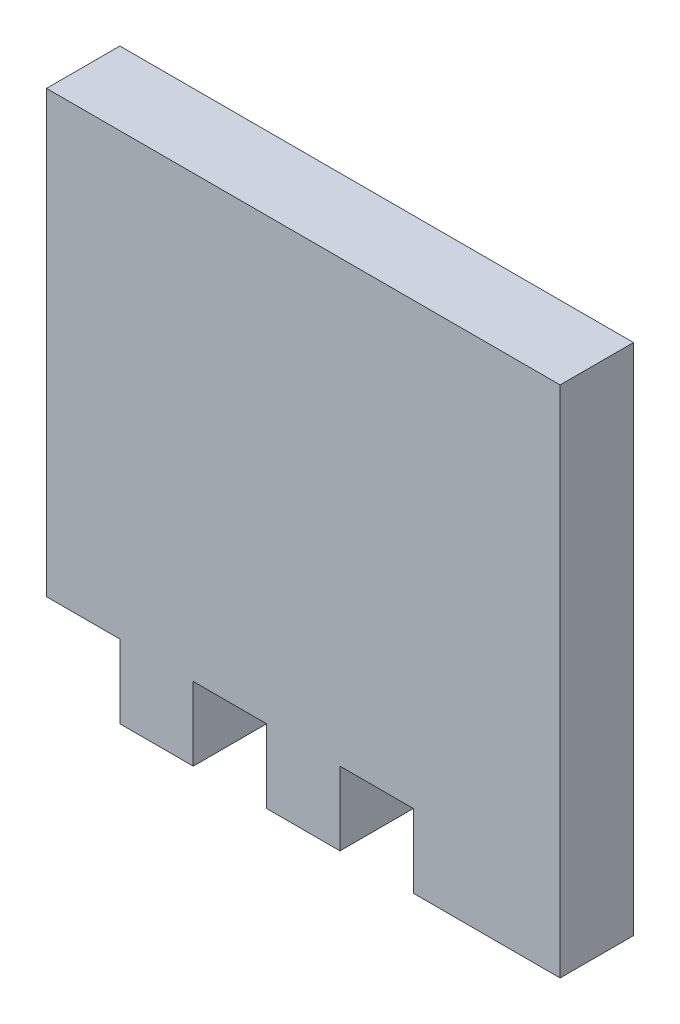
ISO-10303-21;
HEADER;
FILE_DESCRIPTION(('STEP AP214'),'2;1');
FILE_NAME('part.step','',(''),(''),'','','');
FILE_SCHEMA(('AUTOMOTIVE_DESIGN { 1 0 10303 214 1 1 1 1 }'));
ENDSEC;
DATA;
#1=APPLICATION_CONTEXT('core data for automotive mechanical design processes');
#2=APPLICATION_PROTOCOL_DEFINITION('international standard','automotive_design',2000,#1);
#3=PRODUCT_CONTEXT('',#1,'mechanical');
#4=PRODUCT('Part','Part','',(#3));
#5=PRODUCT_RELATED_PRODUCT_CATEGORY('part','',(#4));
#6=PRODUCT_DEFINITION_FORMATION('','',#4);
#7=PRODUCT_DEFINITION_CONTEXT('part definition',#1,'design');
#8=PRODUCT_DEFINITION('design','',#6,#7);
#9=PRODUCT_DEFINITION_SHAPE('','',#8);
#10=(LENGTH_UNIT() NAMED_UNIT(*) SI_UNIT(.MILLI.,.METRE.));
#11=(NAMED_UNIT(*) PLANE_ANGLE_UNIT() SI_UNIT($,.RADIAN.));
#12=(NAMED_UNIT(*) SI_UNIT($,.STERADIAN.) SOLID_ANGLE_UNIT());
#13=UNCERTAINTY_MEASURE_WITH_UNIT(LENGTH_MEASURE(1.E-05),#10,'distance_accuracy_value','');
#14=(GEOMETRIC_REPRESENTATION_CONTEXT(3) GLOBAL_UNCERTAINTY_ASSIGNED_CONTEXT((#13)) GLOBAL_UNIT_ASSIGNED_CONTEXT((#10,
#11,#12)) REPRESENTATION_CONTEXT('',''));
#15=CARTESIAN_POINT('',(0.,0.,0.));
#16=DIRECTION('',(0.,0.,1.));
#17=DIRECTION('',(1.,0.,0.));
#18=AXIS2_PLACEMENT_3D('',#15,#16,#17);
#19=CARTESIAN_POINT('',(-68.9999160612194,0.,5.));
#20=DIRECTION('',(1.,0.,0.));
#21=DIRECTION('',(0.,0.,-1.));
#22=AXIS2_PLACEMENT_3D('',#19,#20,#21);
#23=PLANE('',#22);
#24=DIRECTION('',(0.,-1.,0.));
#25=VECTOR('',#24,1.);
#26=CARTESIAN_POINT('',(-68.9999160612194,0.,0.));
#27=LINE('',#26,#25);
#28=CARTESIAN_POINT('',(-68.9999160612194,30.,0.));
#29=VERTEX_POINT('',#28);
#30=CARTESIAN_POINT('',(-68.9999160612194,0.,0.));
#31=VERTEX_POINT('',#30);
#32=EDGE_CURVE('E164',#29,#31,#27,.T.);
#33=ORIENTED_EDGE('',*,*,#32,.T.);
#34=DIRECTION('',(0.,0.,-1.));
#35=VECTOR('',#34,1.);
#36=CARTESIAN_POINT('',(-68.9999160612194,0.,5.));
#37=LINE('',#36,#35);
#38=CARTESIAN_POINT('',(-68.9999160612194,0.,5.));
#39=VERTEX_POINT('',#38);
#40=EDGE_CURVE('E11',#39,#31,#37,.T.);
#41=ORIENTED_EDGE('',*,*,#40,.F.);
#42=DIRECTION('',(0.,-1.,0.));
#43=VECTOR('',#42,1.);
#44=CARTESIAN_POINT('',(-68.9999160612194,0.,5.));
#45=LINE('',#44,#43);
#46=CARTESIAN_POINT('',(-68.9999160612194,30.,5.));
#47=VERTEX_POINT('',#46);
#48=EDGE_CURVE('E190',#47,#39,#45,.T.);
#49=ORIENTED_EDGE('',*,*,#48,.F.);
#50=DIRECTION('',(0.,0.,-1.));
#51=VECTOR('',#50,1.);
#52=CARTESIAN_POINT('',(-68.9999160612194,30.,5.));
#53=LINE('',#52,#51);
#54=EDGE_CURVE('E160',#47,#29,#53,.T.);
#55=ORIENTED_EDGE('',*,*,#54,.T.);
#56=EDGE_LOOP('',(#33,#41,#49,#55));
#57=FACE_BOUND('',#56,.T.);
#58=ADVANCED_FACE('F32',(#57),#23,.F.);
#59=CARTESIAN_POINT('',(-68.9999160612194,0.,5.));
#60=DIRECTION('',(0.,1.,0.));
#61=DIRECTION('',(0.,0.,1.));
#62=AXIS2_PLACEMENT_3D('',#59,#60,#61);
#63=PLANE('',#62);
#64=DIRECTION('',(1.,0.,0.));
#65=VECTOR('',#64,1.);
#66=CARTESIAN_POINT('',(-68.9999160612194,0.,0.));
#67=LINE('',#66,#65);
#68=CARTESIAN_POINT('',(-63.9999160612194,0.,0.));
#69=VERTEX_POINT('',#68);
#70=EDGE_CURVE('E167',#31,#69,#67,.T.);
#71=ORIENTED_EDGE('',*,*,#70,.T.);
#72=DIRECTION('',(0.,0.,-1.));
#73=VECTOR('',#72,1.);
#74=CARTESIAN_POINT('',(-63.9999160612194,0.,5.));
#75=LINE('',#74,#73);
#76=CARTESIAN_POINT('',(-63.9999160612194,0.,5.));
#77=VERTEX_POINT('',#76);
#78=EDGE_CURVE('E40',#77,#69,#75,.T.);
#79=ORIENTED_EDGE('',*,*,#78,.F.);
#80=DIRECTION('',(1.,0.,0.));
#81=VECTOR('',#80,1.);
#82=CARTESIAN_POINT('',(-68.9999160612194,0.,5.));
#83=LINE('',#82,#81);
#84=EDGE_CURVE('E109',#39,#77,#83,.T.);
#85=ORIENTED_EDGE('',*,*,#84,.F.);
#86=ORIENTED_EDGE('',*,*,#40,.T.);
#87=EDGE_LOOP('',(#71,#79,#85,#86));
#88=FACE_BOUND('',#87,.T.);
#89=ADVANCED_FACE('F278',(#88),#63,.F.);
#90=CARTESIAN_POINT('',(-63.9999160612194,0.,5.));
#91=DIRECTION('',(1.,0.,0.));
#92=DIRECTION('',(0.,0.,-1.));
#93=AXIS2_PLACEMENT_3D('',#90,#91,#92);
#94=PLANE('',#93);
#95=DIRECTION('',(0.,-1.,0.));
#96=VECTOR('',#95,1.);
#97=CARTESIAN_POINT('',(-63.9999160612194,0.,0.));
#98=LINE('',#97,#96);
#99=CARTESIAN_POINT('',(-63.9999160612194,-5.,0.));
#100=VERTEX_POINT('',#99);
#101=EDGE_CURVE('E169',#69,#100,#98,.T.);
#102=ORIENTED_EDGE('',*,*,#101,.T.);
#103=DIRECTION('',(0.,0.,-1.));
#104=VECTOR('',#103,1.);
#105=CARTESIAN_POINT('',(-63.9999160612194,-5.,5.));
#106=LINE('',#105,#104);
#107=CARTESIAN_POINT('',(-63.9999160612194,-5.,5.));
#108=VERTEX_POINT('',#107);
#109=EDGE_CURVE('E215',#108,#100,#106,.T.);
#110=ORIENTED_EDGE('',*,*,#109,.F.);
#111=DIRECTION('',(0.,-1.,0.));
#112=VECTOR('',#111,1.);
#113=CARTESIAN_POINT('',(-63.9999160612194,0.,5.));
#114=LINE('',#113,#112);
#115=EDGE_CURVE('E223',#77,#108,#114,.T.);
#116=ORIENTED_EDGE('',*,*,#115,.F.);
#117=ORIENTED_EDGE('',*,*,#78,.T.);
#118=EDGE_LOOP('',(#102,#110,#116,#117));
#119=FACE_BOUND('',#118,.T.);
#120=ADVANCED_FACE('F221',(#119),#94,.F.);
#121=CARTESIAN_POINT('',(-63.9999160612194,-5.,5.));
#122=DIRECTION('',(0.,1.,0.));
#123=DIRECTION('',(0.,0.,1.));
#124=AXIS2_PLACEMENT_3D('',#121,#122,#123);
#125=PLANE('',#124);
#126=DIRECTION('',(1.,0.,0.));
#127=VECTOR('',#126,1.);
#128=CARTESIAN_POINT('',(-63.9999160612194,-5.,0.));
#129=LINE('',#128,#127);
#130=CARTESIAN_POINT('',(-58.9999160612194,-5.,0.));
#131=VERTEX_POINT('',#130);
#132=EDGE_CURVE('E171',#100,#131,#129,.T.);
#133=ORIENTED_EDGE('',*,*,#132,.T.);
#134=DIRECTION('',(0.,0.,-1.));
#135=VECTOR('',#134,1.);
#136=CARTESIAN_POINT('',(-58.9999160612194,-5.,5.));
#137=LINE('',#136,#135);
#138=CARTESIAN_POINT('',(-58.9999160612194,-5.,5.));
#139=VERTEX_POINT('',#138);
#140=EDGE_CURVE('E212',#139,#131,#137,.T.);
#141=ORIENTED_EDGE('',*,*,#140,.F.);
#142=DIRECTION('',(1.,0.,0.));
#143=VECTOR('',#142,1.);
#144=CARTESIAN_POINT('',(-63.9999160612194,-5.,5.));
#145=LINE('',#144,#143);
#146=EDGE_CURVE('E241',#108,#139,#145,.T.);
#147=ORIENTED_EDGE('',*,*,#146,.F.);
#148=ORIENTED_EDGE('',*,*,#109,.T.);
#149=EDGE_LOOP('',(#133,#141,#147,#148));
#150=FACE_BOUND('',#149,.T.);
#151=ADVANCED_FACE('F232',(#150),#125,.F.);
#152=CARTESIAN_POINT('',(-58.9999160612194,-5.,5.));
#153=DIRECTION('',(-1.,0.,0.));
#154=DIRECTION('',(0.,0.,1.));
#155=AXIS2_PLACEMENT_3D('',#152,#153,#154);
#156=PLANE('',#155);
#157=DIRECTION('',(0.,1.,0.));
#158=VECTOR('',#157,1.);
#159=CARTESIAN_POINT('',(-58.9999160612194,-5.,0.));
#160=LINE('',#159,#158);
#161=CARTESIAN_POINT('',(-58.9999160612194,0.,0.));
#162=VERTEX_POINT('',#161);
#163=EDGE_CURVE('E173',#131,#162,#160,.T.);
#164=ORIENTED_EDGE('',*,*,#163,.T.);
#165=DIRECTION('',(0.,0.,-1.));
#166=VECTOR('',#165,1.);
#167=CARTESIAN_POINT('',(-58.9999160612194,0.,5.));
#168=LINE('',#167,#166);
#169=CARTESIAN_POINT('',(-58.9999160612194,0.,5.));
#170=VERTEX_POINT('',#169);
#171=EDGE_CURVE('E209',#170,#162,#168,.T.);
#172=ORIENTED_EDGE('',*,*,#171,.F.);
#173=DIRECTION('',(0.,1.,0.));
#174=VECTOR('',#173,1.);
#175=CARTESIAN_POINT('',(-58.9999160612194,-5.,5.));
#176=LINE('',#175,#174);
#177=EDGE_CURVE('E238',#139,#170,#176,.T.);
#178=ORIENTED_EDGE('',*,*,#177,.F.);
#179=ORIENTED_EDGE('',*,*,#140,.T.);
#180=EDGE_LOOP('',(#164,#172,#178,#179));
#181=FACE_BOUND('',#180,.T.);
#182=ADVANCED_FACE('F236',(#181),#156,.F.);
#183=CARTESIAN_POINT('',(-58.9999160612194,0.,5.));
#184=DIRECTION('',(0.,1.,0.));
#185=DIRECTION('',(0.,0.,1.));
#186=AXIS2_PLACEMENT_3D('',#183,#184,#185);
#187=PLANE('',#186);
#188=DIRECTION('',(1.,0.,0.));
#189=VECTOR('',#188,1.);
#190=CARTESIAN_POINT('',(-58.9999160612194,0.,0.));
#191=LINE('',#190,#189);
#192=CARTESIAN_POINT('',(-53.9999160612194,0.,0.));
#193=VERTEX_POINT('',#192);
#194=EDGE_CURVE('E175',#162,#193,#191,.T.);
#195=ORIENTED_EDGE('',*,*,#194,.T.);
#196=DIRECTION('',(0.,0.,-1.));
#197=VECTOR('',#196,1.);
#198=CARTESIAN_POINT('',(-53.9999160612194,0.,5.));
#199=LINE('',#198,#197);
#200=CARTESIAN_POINT('',(-53.9999160612194,0.,5.));
#201=VERTEX_POINT('',#200);
#202=EDGE_CURVE('E206',#201,#193,#199,.T.);
#203=ORIENTED_EDGE('',*,*,#202,.F.);
#204=DIRECTION('',(1.,0.,0.));
#205=VECTOR('',#204,1.);
#206=CARTESIAN_POINT('',(-58.9999160612194,0.,5.));
#207=LINE('',#206,#205);
#208=EDGE_CURVE('E240',#170,#201,#207,.T.);
#209=ORIENTED_EDGE('',*,*,#208,.F.);
#210=ORIENTED_EDGE('',*,*,#171,.T.);
#211=EDGE_LOOP('',(#195,#203,#209,#210));
#212=FACE_BOUND('',#211,.T.);
#213=ADVANCED_FACE('F291',(#212),#187,.F.);
#214=CARTESIAN_POINT('',(-53.9999160612194,0.,5.));
#215=DIRECTION('',(1.,0.,0.));
#216=DIRECTION('',(0.,0.,-1.));
#217=AXIS2_PLACEMENT_3D('',#214,#215,#216);
#218=PLANE('',#217);
#219=DIRECTION('',(0.,-1.,0.));
#220=VECTOR('',#219,1.);
#221=CARTESIAN_POINT('',(-53.9999160612194,0.,0.));
#222=LINE('',#221,#220);
#223=CARTESIAN_POINT('',(-53.9999160612194,-5.,0.));
#224=VERTEX_POINT('',#223);
#225=EDGE_CURVE('E177',#193,#224,#222,.T.);
#226=ORIENTED_EDGE('',*,*,#225,.T.);
#227=DIRECTION('',(0.,0.,-1.));
#228=VECTOR('',#227,1.);
#229=CARTESIAN_POINT('',(-53.9999160612194,-5.,5.));
#230=LINE('',#229,#228);
#231=CARTESIAN_POINT('',(-53.9999160612194,-5.,5.));
#232=VERTEX_POINT('',#231);
#233=EDGE_CURVE('E203',#232,#224,#230,.T.);
#234=ORIENTED_EDGE('',*,*,#233,.F.);
#235=DIRECTION('',(0.,-1.,0.));
#236=VECTOR('',#235,1.);
#237=CARTESIAN_POINT('',(-53.9999160612194,0.,5.));
#238=LINE('',#237,#236);
#239=EDGE_CURVE('E243',#201,#232,#238,.T.);
#240=ORIENTED_EDGE('',*,*,#239,.F.);
#241=ORIENTED_EDGE('',*,*,#202,.T.);
#242=EDGE_LOOP('',(#226,#234,#240,#241));
#243=FACE_BOUND('',#242,.T.);
#244=ADVANCED_FACE('F294',(#243),#218,.F.);
#245=CARTESIAN_POINT('',(-53.9999160612194,-5.,5.));
#246=DIRECTION('',(0.,1.,0.));
#247=DIRECTION('',(0.,0.,1.));
#248=AXIS2_PLACEMENT_3D('',#245,#246,#247);
#249=PLANE('',#248);
#250=DIRECTION('',(1.,0.,0.));
#251=VECTOR('',#250,1.);
#252=CARTESIAN_POINT('',(-53.9999160612194,-5.,0.));
#253=LINE('',#252,#251);
#254=CARTESIAN_POINT('',(-48.9999160612194,-5.,0.));
#255=VERTEX_POINT('',#254);
#256=EDGE_CURVE('E179',#224,#255,#253,.T.);
#257=ORIENTED_EDGE('',*,*,#256,.T.);
#258=DIRECTION('',(0.,0.,-1.));
#259=VECTOR('',#258,1.);
#260=CARTESIAN_POINT('',(-48.9999160612194,-5.,5.));
#261=LINE('',#260,#259);
#262=CARTESIAN_POINT('',(-48.9999160612194,-5.,5.));
#263=VERTEX_POINT('',#262);
#264=EDGE_CURVE('E200',#263,#255,#261,.T.);
#265=ORIENTED_EDGE('',*,*,#264,.F.);
#266=DIRECTION('',(1.,0.,0.));
#267=VECTOR('',#266,1.);
#268=CARTESIAN_POINT('',(-53.9999160612194,-5.,5.));
#269=LINE('',#268,#267);
#270=EDGE_CURVE('E249',#232,#263,#269,.T.);
#271=ORIENTED_EDGE('',*,*,#270,.F.);
#272=ORIENTED_EDGE('',*,*,#233,.T.);
#273=EDGE_LOOP('',(#257,#265,#271,#272));
#274=FACE_BOUND('',#273,.T.);
#275=ADVANCED_FACE('F298',(#274),#249,.F.);
#276=CARTESIAN_POINT('',(-48.9999160612194,-5.,5.));
#277=DIRECTION('',(-1.,0.,0.));
#278=DIRECTION('',(0.,0.,1.));
#279=AXIS2_PLACEMENT_3D('',#276,#277,#278);
#280=PLANE('',#279);
#281=DIRECTION('',(0.,1.,0.));
#282=VECTOR('',#281,1.);
#283=CARTESIAN_POINT('',(-48.9999160612194,-5.,0.));
#284=LINE('',#283,#282);
#285=CARTESIAN_POINT('',(-48.9999160612194,0.,0.));
#286=VERTEX_POINT('',#285);
#287=EDGE_CURVE('E181',#255,#286,#284,.T.);
#288=ORIENTED_EDGE('',*,*,#287,.T.);
#289=DIRECTION('',(0.,0.,-1.));
#290=VECTOR('',#289,1.);
#291=CARTESIAN_POINT('',(-48.9999160612194,0.,5.));
#292=LINE('',#291,#290);
#293=CARTESIAN_POINT('',(-48.9999160612194,0.,5.));
#294=VERTEX_POINT('',#293);
#295=EDGE_CURVE('E197',#294,#286,#292,.T.);
#296=ORIENTED_EDGE('',*,*,#295,.F.);
#297=DIRECTION('',(0.,1.,0.));
#298=VECTOR('',#297,1.);
#299=CARTESIAN_POINT('',(-48.9999160612194,-5.,5.));
#300=LINE('',#299,#298);
#301=EDGE_CURVE('E251',#263,#294,#300,.T.);
#302=ORIENTED_EDGE('',*,*,#301,.F.);
#303=ORIENTED_EDGE('',*,*,#264,.T.);
#304=EDGE_LOOP('',(#288,#296,#302,#303));
#305=FACE_BOUND('',#304,.T.);
#306=ADVANCED_FACE('F302',(#305),#280,.F.);
#307=CARTESIAN_POINT('',(-48.9999160612194,0.,5.));
#308=DIRECTION('',(0.,1.,0.));
#309=DIRECTION('',(0.,0.,1.));
#310=AXIS2_PLACEMENT_3D('',#307,#308,#309);
#311=PLANE('',#310);
#312=DIRECTION('',(1.,0.,0.));
#313=VECTOR('',#312,1.);
#314=CARTESIAN_POINT('',(-48.9999160612194,0.,0.));
#315=LINE('',#314,#313);
#316=CARTESIAN_POINT('',(-43.9999160612194,0.,0.));
#317=VERTEX_POINT('',#316);
#318=EDGE_CURVE('E183',#286,#317,#315,.T.);
#319=ORIENTED_EDGE('',*,*,#318,.T.);
#320=DIRECTION('',(0.,0.,-1.));
#321=VECTOR('',#320,1.);
#322=CARTESIAN_POINT('',(-43.9999160612194,0.,5.));
#323=LINE('',#322,#321);
#324=CARTESIAN_POINT('',(-43.9999160612194,0.,5.));
#325=VERTEX_POINT('',#324);
#326=EDGE_CURVE('E194',#325,#317,#323,.T.);
#327=ORIENTED_EDGE('',*,*,#326,.F.);
#328=DIRECTION('',(1.,0.,0.));
#329=VECTOR('',#328,1.);
#330=CARTESIAN_POINT('',(-48.9999160612194,0.,5.));
#331=LINE('',#330,#329);
#332=EDGE_CURVE('E253',#294,#325,#331,.T.);
#333=ORIENTED_EDGE('',*,*,#332,.F.);
#334=ORIENTED_EDGE('',*,*,#295,.T.);
#335=EDGE_LOOP('',(#319,#327,#333,#334));
#336=FACE_BOUND('',#335,.T.);
#337=ADVANCED_FACE('F259',(#336),#311,.F.);
#338=CARTESIAN_POINT('',(-43.9999160612194,0.,5.));
#339=DIRECTION('',(1.,0.,0.));
#340=DIRECTION('',(0.,0.,-1.));
#341=AXIS2_PLACEMENT_3D('',#338,#339,#340);
#342=PLANE('',#341);
#343=DIRECTION('',(0.,-1.,0.));
#344=VECTOR('',#343,1.);
#345=CARTESIAN_POINT('',(-43.9999160612194,0.,0.));
#346=LINE('',#345,#344);
#347=CARTESIAN_POINT('',(-43.9999160612194,-5.,0.));
#348=VERTEX_POINT('',#347);
#349=EDGE_CURVE('E185',#317,#348,#346,.T.);
#350=ORIENTED_EDGE('',*,*,#349,.T.);
#351=DIRECTION('',(0.,0.,-1.));
#352=VECTOR('',#351,1.);
#353=CARTESIAN_POINT('',(-43.9999160612194,-5.,5.));
#354=LINE('',#353,#352);
#355=CARTESIAN_POINT('',(-43.9999160612194,-5.,5.));
#356=VERTEX_POINT('',#355);
#357=EDGE_CURVE('E155',#356,#348,#354,.T.);
#358=ORIENTED_EDGE('',*,*,#357,.F.);
#359=DIRECTION('',(0.,-1.,0.));
#360=VECTOR('',#359,1.);
#361=CARTESIAN_POINT('',(-43.9999160612194,0.,5.));
#362=LINE('',#361,#360);
#363=EDGE_CURVE('E146',#325,#356,#362,.T.);
#364=ORIENTED_EDGE('',*,*,#363,.F.);
#365=ORIENTED_EDGE('',*,*,#326,.T.);
#366=EDGE_LOOP('',(#350,#358,#364,#365));
#367=FACE_BOUND('',#366,.T.);
#368=ADVANCED_FACE('F263',(#367),#342,.F.);
#369=CARTESIAN_POINT('',(-43.9999160612194,-5.,5.));
#370=DIRECTION('',(0.,1.,0.));
#371=DIRECTION('',(0.,0.,1.));
#372=AXIS2_PLACEMENT_3D('',#369,#370,#371);
#373=PLANE('',#372);
#374=DIRECTION('',(1.,0.,0.));
#375=VECTOR('',#374,1.);
#376=CARTESIAN_POINT('',(-43.9999160612194,-5.,0.));
#377=LINE('',#376,#375);
#378=CARTESIAN_POINT('',(-33.9999160612194,-5.,0.));
#379=VERTEX_POINT('',#378);
#380=EDGE_CURVE('E154',#348,#379,#377,.T.);
#381=ORIENTED_EDGE('',*,*,#380,.T.);
#382=DIRECTION('',(0.,0.,-1.));
#383=VECTOR('',#382,1.);
#384=CARTESIAN_POINT('',(-33.9999160612194,-5.,5.));
#385=LINE('',#384,#383);
#386=CARTESIAN_POINT('',(-33.9999160612194,-5.,5.));
#387=VERTEX_POINT('',#386);
#388=EDGE_CURVE('E151',#387,#379,#385,.T.);
#389=ORIENTED_EDGE('',*,*,#388,.F.);
#390=DIRECTION('',(1.,0.,0.));
#391=VECTOR('',#390,1.);
#392=CARTESIAN_POINT('',(-43.9999160612194,-5.,5.));
#393=LINE('',#392,#391);
#394=EDGE_CURVE('E140',#356,#387,#393,.T.);
#395=ORIENTED_EDGE('',*,*,#394,.F.);
#396=ORIENTED_EDGE('',*,*,#357,.T.);
#397=EDGE_LOOP('',(#381,#389,#395,#396));
#398=FACE_BOUND('',#397,.T.);
#399=ADVANCED_FACE('F152',(#398),#373,.F.);
#400=CARTESIAN_POINT('',(-33.9999160612194,-5.,5.));
#401=DIRECTION('',(-1.,0.,0.));
#402=DIRECTION('',(0.,0.,1.));
#403=AXIS2_PLACEMENT_3D('',#400,#401,#402);
#404=PLANE('',#403);
#405=DIRECTION('',(0.,1.,0.));
#406=VECTOR('',#405,1.);
#407=CARTESIAN_POINT('',(-33.9999160612194,-5.,0.));
#408=LINE('',#407,#406);
#409=CARTESIAN_POINT('',(-33.9999160612194,30.,0.));
#410=VERTEX_POINT('',#409);
#411=EDGE_CURVE('E95',#379,#410,#408,.T.);
#412=ORIENTED_EDGE('',*,*,#411,.T.);
#413=DIRECTION('',(0.,0.,-1.));
#414=VECTOR('',#413,1.);
#415=CARTESIAN_POINT('',(-33.9999160612194,30.,5.));
#416=LINE('',#415,#414);
#417=CARTESIAN_POINT('',(-33.9999160612194,30.,5.));
#418=VERTEX_POINT('',#417);
#419=EDGE_CURVE('E156',#418,#410,#416,.T.);
#420=ORIENTED_EDGE('',*,*,#419,.F.);
#421=DIRECTION('',(0.,1.,0.));
#422=VECTOR('',#421,1.);
#423=CARTESIAN_POINT('',(-33.9999160612194,-5.,5.));
#424=LINE('',#423,#422);
#425=EDGE_CURVE('E144',#387,#418,#424,.T.);
#426=ORIENTED_EDGE('',*,*,#425,.F.);
#427=ORIENTED_EDGE('',*,*,#388,.T.);
#428=EDGE_LOOP('',(#412,#420,#426,#427));
#429=FACE_BOUND('',#428,.T.);
#430=ADVANCED_FACE('F158',(#429),#404,.F.);
#431=CARTESIAN_POINT('',(-68.9999160612194,30.,5.));
#432=DIRECTION('',(0.,-1.,0.));
#433=DIRECTION('',(1.,0.,0.));
#434=AXIS2_PLACEMENT_3D('',#431,#432,#433);
#435=PLANE('',#434);
#436=DIRECTION('',(-1.,0.,0.));
#437=VECTOR('',#436,1.);
#438=CARTESIAN_POINT('',(-68.9999160612194,30.,0.));
#439=LINE('',#438,#437);
#440=EDGE_CURVE('E101',#410,#29,#439,.T.);
#441=ORIENTED_EDGE('',*,*,#440,.T.);
#442=ORIENTED_EDGE('',*,*,#54,.F.);
#443=DIRECTION('',(-1.,0.,0.));
#444=VECTOR('',#443,1.);
#445=CARTESIAN_POINT('',(-68.9999160612194,30.,5.));
#446=LINE('',#445,#444);
#447=EDGE_CURVE('E48',#418,#47,#446,.T.);
#448=ORIENTED_EDGE('',*,*,#447,.F.);
#449=ORIENTED_EDGE('',*,*,#419,.T.);
#450=EDGE_LOOP('',(#441,#442,#448,#449));
#451=FACE_BOUND('',#450,.T.);
#452=ADVANCED_FACE('F267',(#451),#435,.F.);
#453=CARTESIAN_POINT('',(0.,0.,5.));
#454=DIRECTION('',(0.,0.,-1.));
#455=DIRECTION('',(-1.,0.,0.));
#456=AXIS2_PLACEMENT_3D('',#453,#454,#455);
#457=PLANE('',#456);
#458=ORIENTED_EDGE('',*,*,#48,.T.);
#459=ORIENTED_EDGE('',*,*,#84,.T.);
#460=ORIENTED_EDGE('',*,*,#115,.T.);
#461=ORIENTED_EDGE('',*,*,#146,.T.);
#462=ORIENTED_EDGE('',*,*,#177,.T.);
#463=ORIENTED_EDGE('',*,*,#208,.T.);
#464=ORIENTED_EDGE('',*,*,#239,.T.);
#465=ORIENTED_EDGE('',*,*,#270,.T.);
#466=ORIENTED_EDGE('',*,*,#301,.T.);
#467=ORIENTED_EDGE('',*,*,#332,.T.);
#468=ORIENTED_EDGE('',*,*,#363,.T.);
#469=ORIENTED_EDGE('',*,*,#394,.T.);
#470=ORIENTED_EDGE('',*,*,#425,.T.);
#471=ORIENTED_EDGE('',*,*,#447,.T.);
#472=EDGE_LOOP('',(#458,#459,#460,#461,#462,#463,#464,#465,#466,#467,#468,#469,#470,#471));
#473=FACE_BOUND('',#472,.T.);
#474=ADVANCED_FACE('F142',(#473),#457,.F.);
#475=CARTESIAN_POINT('',(0.,0.,0.));
#476=DIRECTION('',(0.,0.,-1.));
#477=DIRECTION('',(-1.,0.,0.));
#478=AXIS2_PLACEMENT_3D('',#475,#476,#477);
#479=PLANE('',#478);
#480=ORIENTED_EDGE('',*,*,#32,.F.);
#481=ORIENTED_EDGE('',*,*,#440,.F.);
#482=ORIENTED_EDGE('',*,*,#411,.F.);
#483=ORIENTED_EDGE('',*,*,#380,.F.);
#484=ORIENTED_EDGE('',*,*,#349,.F.);
#485=ORIENTED_EDGE('',*,*,#318,.F.);
#486=ORIENTED_EDGE('',*,*,#287,.F.);
#487=ORIENTED_EDGE('',*,*,#256,.F.);
#488=ORIENTED_EDGE('',*,*,#225,.F.);
#489=ORIENTED_EDGE('',*,*,#194,.F.);
#490=ORIENTED_EDGE('',*,*,#163,.F.);
#491=ORIENTED_EDGE('',*,*,#132,.F.);
#492=ORIENTED_EDGE('',*,*,#101,.F.);
#493=ORIENTED_EDGE('',*,*,#70,.F.);
#494=EDGE_LOOP('',(#480,#481,#482,#483,#484,#485,#486,#487,#488,#489,#490,#491,#492,#493));
#495=FACE_BOUND('',#494,.T.);
#496=ADVANCED_FACE('F227',(#495),#479,.T.);
#497=CLOSED_SHELL('',(#58,#89,#120,#151,#182,#213,#244,#275,#306,#337,#368,#399,#430,#452,#474,#496));
#498=MANIFOLD_SOLID_BREP('B2',#497);
#499=ADVANCED_BREP_SHAPE_REPRESENTATION('',(#18,#498),#14);
#500=SHAPE_DEFINITION_REPRESENTATION(#9,#499);
ENDSEC;
END-ISO-10303-21;
